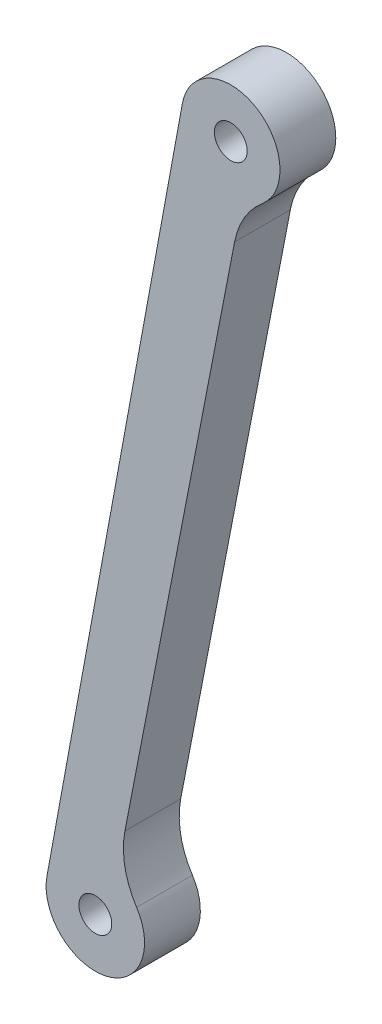
ISO-10303-21;
HEADER;
FILE_DESCRIPTION(('STEP AP214'),'2;1');
FILE_NAME('part.step','',(''),(''),'','','');
FILE_SCHEMA(('AUTOMOTIVE_DESIGN { 1 0 10303 214 1 1 1 1 }'));
ENDSEC;
DATA;
#1=APPLICATION_CONTEXT('core data for automotive mechanical design processes');
#2=APPLICATION_PROTOCOL_DEFINITION('international standard','automotive_design',2000,#1);
#3=PRODUCT_CONTEXT('',#1,'mechanical');
#4=PRODUCT('Part','Part','',(#3));
#5=PRODUCT_RELATED_PRODUCT_CATEGORY('part','',(#4));
#6=PRODUCT_DEFINITION_FORMATION('','',#4);
#7=PRODUCT_DEFINITION_CONTEXT('part definition',#1,'design');
#8=PRODUCT_DEFINITION('design','',#6,#7);
#9=PRODUCT_DEFINITION_SHAPE('','',#8);
#10=(LENGTH_UNIT() NAMED_UNIT(*) SI_UNIT(.MILLI.,.METRE.));
#11=(NAMED_UNIT(*) PLANE_ANGLE_UNIT() SI_UNIT($,.RADIAN.));
#12=(NAMED_UNIT(*) SI_UNIT($,.STERADIAN.) SOLID_ANGLE_UNIT());
#13=UNCERTAINTY_MEASURE_WITH_UNIT(LENGTH_MEASURE(1.E-05),#10,'distance_accuracy_value','');
#14=(GEOMETRIC_REPRESENTATION_CONTEXT(3) GLOBAL_UNCERTAINTY_ASSIGNED_CONTEXT((#13)) GLOBAL_UNIT_ASSIGNED_CONTEXT((#10,
#11,#12)) REPRESENTATION_CONTEXT('',''));
#15=CARTESIAN_POINT('',(0.,0.,0.));
#16=DIRECTION('',(0.,0.,1.));
#17=DIRECTION('',(1.,0.,0.));
#18=AXIS2_PLACEMENT_3D('',#15,#16,#17);
#19=CARTESIAN_POINT('',(31.2850615359514,81.9192149804247,3.4));
#20=DIRECTION('',(0.,0.,-1.));
#21=DIRECTION('',(-1.,0.,0.));
#22=AXIS2_PLACEMENT_3D('',#19,#20,#21);
#23=PLANE('',#22);
#24=CARTESIAN_POINT('',(31.2850615359514,81.9192149804247,3.4));
#25=DIRECTION('',(0.,0.,-1.));
#26=DIRECTION('',(-1.,0.,0.));
#27=AXIS2_PLACEMENT_3D('',#24,#25,#26);
#28=CIRCLE('',#27,5.);
#29=CARTESIAN_POINT('',(26.3766543349856,82.871863262587,3.4));
#30=VERTEX_POINT('',#29);
#31=CARTESIAN_POINT('',(28.0730585094993,85.75106003967,3.4));
#32=VERTEX_POINT('',#31);
#33=EDGE_CURVE('E128',#30,#32,#28,.T.);
#34=ORIENTED_EDGE('',*,*,#33,.T.);
#35=CARTESIAN_POINT('',(26.145856693628,88.0501670752172,3.4));
#36=DIRECTION('',(0.,0.,1.));
#37=DIRECTION('',(1.,0.,0.));
#38=AXIS2_PLACEMENT_3D('',#35,#36,#37);
#39=CIRCLE('',#38,3.);
#40=CARTESIAN_POINT('',(23.1952741449533,88.592442488136,3.4));
#41=VERTEX_POINT('',#40);
#42=EDGE_CURVE('E86',#32,#41,#39,.T.);
#43=ORIENTED_EDGE('',*,*,#42,.T.);
#44=DIRECTION('',(-0.180758470972937,-0.983527516224903,0.));
#45=VECTOR('',#44,1.);
#46=CARTESIAN_POINT('',(14.9394943531754,43.6718003218127,3.4));
#47=LINE('',#46,#45);
#48=CARTESIAN_POINT('',(14.9394943531754,43.6718003218127,3.4));
#49=VERTEX_POINT('',#48);
#50=EDGE_CURVE('E99',#41,#49,#47,.T.);
#51=ORIENTED_EDGE('',*,*,#50,.T.);
#52=CARTESIAN_POINT('',(17.8900769018501,43.1295249088939,3.4));
#53=DIRECTION('',(0.,0.,1.));
#54=DIRECTION('',(1.,0.,0.));
#55=AXIS2_PLACEMENT_3D('',#52,#53,#54);
#56=CIRCLE('',#55,3.);
#57=CARTESIAN_POINT('',(20.406889033319,44.7622088020254,3.4));
#58=VERTEX_POINT('',#57);
#59=EDGE_CURVE('E93',#49,#58,#56,.T.);
#60=ORIENTED_EDGE('',*,*,#59,.T.);
#61=CARTESIAN_POINT('',(24.6015759191005,47.4833486239112,3.4));
#62=DIRECTION('',(0.,0.,-1.));
#63=DIRECTION('',(1.,0.,0.));
#64=AXIS2_PLACEMENT_3D('',#61,#62,#63);
#65=CIRCLE('',#64,5.);
#66=CARTESIAN_POINT('',(19.6931687181346,48.4359969060735,3.4));
#67=VERTEX_POINT('',#66);
#68=EDGE_CURVE('E97',#58,#67,#65,.T.);
#69=ORIENTED_EDGE('',*,*,#68,.T.);
#70=DIRECTION('',(0.190529656432457,0.981681440193166,0.));
#71=VECTOR('',#70,1.);
#72=CARTESIAN_POINT('',(19.6931687181346,48.4359969060735,3.4));
#73=LINE('',#72,#71);
#74=EDGE_CURVE('E49',#67,#30,#73,.T.);
#75=ORIENTED_EDGE('',*,*,#74,.T.);
#76=EDGE_LOOP('',(#34,#43,#51,#60,#69,#75));
#77=FACE_BOUND('',#76,.T.);
#78=CARTESIAN_POINT('',(17.8900769018501,43.1295249088939,3.4));
#79=DIRECTION('',(0.,0.,1.));
#80=DIRECTION('',(1.,0.,0.));
#81=AXIS2_PLACEMENT_3D('',#78,#79,#80);
#82=CIRCLE('',#81,1.);
#83=CARTESIAN_POINT('',(18.8900769018501,43.1295249088939,3.4));
#84=VERTEX_POINT('',#83);
#85=EDGE_CURVE('E121',#84,#84,#82,.T.);
#86=ORIENTED_EDGE('',*,*,#85,.F.);
#87=EDGE_LOOP('',(#86));
#88=FACE_BOUND('',#87,.T.);
#89=CARTESIAN_POINT('',(26.145856693628,88.0501670752172,3.4));
#90=DIRECTION('',(0.,0.,1.));
#91=DIRECTION('',(1.,0.,0.));
#92=AXIS2_PLACEMENT_3D('',#89,#90,#91);
#93=CIRCLE('',#92,1.);
#94=CARTESIAN_POINT('',(27.145856693628,88.0501670752172,3.4));
#95=VERTEX_POINT('',#94);
#96=EDGE_CURVE('E169',#95,#95,#93,.T.);
#97=ORIENTED_EDGE('',*,*,#96,.F.);
#98=EDGE_LOOP('',(#97));
#99=FACE_BOUND('',#98,.T.);
#100=ADVANCED_FACE('F32',(#77,#88,#99),#23,.F.);
#101=CARTESIAN_POINT('',(31.2850615359514,81.9192149804247,0.));
#102=DIRECTION('',(0.,0.,-1.));
#103=DIRECTION('',(-1.,0.,0.));
#104=AXIS2_PLACEMENT_3D('',#101,#102,#103);
#105=PLANE('',#104);
#106=CARTESIAN_POINT('',(17.8900769018501,43.1295249088939,0.));
#107=DIRECTION('',(0.,0.,1.));
#108=DIRECTION('',(1.,0.,0.));
#109=AXIS2_PLACEMENT_3D('',#106,#107,#108);
#110=CIRCLE('',#109,1.);
#111=CARTESIAN_POINT('',(18.8900769018501,43.1295249088939,0.));
#112=VERTEX_POINT('',#111);
#113=EDGE_CURVE('E174',#112,#112,#110,.T.);
#114=ORIENTED_EDGE('',*,*,#113,.T.);
#115=EDGE_LOOP('',(#114));
#116=FACE_BOUND('',#115,.T.);
#117=CARTESIAN_POINT('',(31.2850615359514,81.9192149804247,0.));
#118=DIRECTION('',(0.,0.,-1.));
#119=DIRECTION('',(-1.,0.,0.));
#120=AXIS2_PLACEMENT_3D('',#117,#118,#119);
#121=CIRCLE('',#120,5.);
#122=CARTESIAN_POINT('',(26.3766543349856,82.871863262587,0.));
#123=VERTEX_POINT('',#122);
#124=CARTESIAN_POINT('',(28.0730585094993,85.75106003967,0.));
#125=VERTEX_POINT('',#124);
#126=EDGE_CURVE('E117',#123,#125,#121,.T.);
#127=ORIENTED_EDGE('',*,*,#126,.F.);
#128=DIRECTION('',(0.190529656432457,0.981681440193166,0.));
#129=VECTOR('',#128,1.);
#130=CARTESIAN_POINT('',(19.6931687181346,48.4359969060735,0.));
#131=LINE('',#130,#129);
#132=CARTESIAN_POINT('',(19.6931687181346,48.4359969060735,0.));
#133=VERTEX_POINT('',#132);
#134=EDGE_CURVE('E78',#133,#123,#131,.T.);
#135=ORIENTED_EDGE('',*,*,#134,.F.);
#136=CARTESIAN_POINT('',(24.6015759191005,47.4833486239112,0.));
#137=DIRECTION('',(0.,0.,-1.));
#138=DIRECTION('',(1.,0.,0.));
#139=AXIS2_PLACEMENT_3D('',#136,#137,#138);
#140=CIRCLE('',#139,5.);
#141=CARTESIAN_POINT('',(20.406889033319,44.7622088020254,0.));
#142=VERTEX_POINT('',#141);
#143=EDGE_CURVE('E72',#142,#133,#140,.T.);
#144=ORIENTED_EDGE('',*,*,#143,.F.);
#145=CARTESIAN_POINT('',(17.8900769018501,43.1295249088939,0.));
#146=DIRECTION('',(0.,0.,1.));
#147=DIRECTION('',(1.,0.,0.));
#148=AXIS2_PLACEMENT_3D('',#145,#146,#147);
#149=CIRCLE('',#148,3.);
#150=CARTESIAN_POINT('',(14.9394943531754,43.6718003218127,0.));
#151=VERTEX_POINT('',#150);
#152=EDGE_CURVE('E107',#151,#142,#149,.T.);
#153=ORIENTED_EDGE('',*,*,#152,.F.);
#154=DIRECTION('',(-0.180758470972937,-0.983527516224903,0.));
#155=VECTOR('',#154,1.);
#156=CARTESIAN_POINT('',(14.9394943531754,43.6718003218127,0.));
#157=LINE('',#156,#155);
#158=CARTESIAN_POINT('',(23.1952741449533,88.592442488136,0.));
#159=VERTEX_POINT('',#158);
#160=EDGE_CURVE('E123',#159,#151,#157,.T.);
#161=ORIENTED_EDGE('',*,*,#160,.F.);
#162=CARTESIAN_POINT('',(26.145856693628,88.0501670752172,0.));
#163=DIRECTION('',(0.,0.,1.));
#164=DIRECTION('',(1.,0.,0.));
#165=AXIS2_PLACEMENT_3D('',#162,#163,#164);
#166=CIRCLE('',#165,3.);
#167=EDGE_CURVE('E120',#125,#159,#166,.T.);
#168=ORIENTED_EDGE('',*,*,#167,.F.);
#169=EDGE_LOOP('',(#127,#135,#144,#153,#161,#168));
#170=FACE_BOUND('',#169,.T.);
#171=CARTESIAN_POINT('',(26.145856693628,88.0501670752172,0.));
#172=DIRECTION('',(0.,0.,1.));
#173=DIRECTION('',(1.,0.,0.));
#174=AXIS2_PLACEMENT_3D('',#171,#172,#173);
#175=CIRCLE('',#174,1.);
#176=CARTESIAN_POINT('',(27.145856693628,88.0501670752172,0.));
#177=VERTEX_POINT('',#176);
#178=EDGE_CURVE('E172',#177,#177,#175,.T.);
#179=ORIENTED_EDGE('',*,*,#178,.T.);
#180=EDGE_LOOP('',(#179));
#181=FACE_BOUND('',#180,.T.);
#182=ADVANCED_FACE('F137',(#116,#170,#181),#105,.T.);
#183=CARTESIAN_POINT('',(31.2850615359514,81.9192149804247,3.4));
#184=DIRECTION('',(0.,0.,-1.));
#185=DIRECTION('',(-1.,0.,0.));
#186=AXIS2_PLACEMENT_3D('',#183,#184,#185);
#187=CYLINDRICAL_SURFACE('',#186,5.);
#188=ORIENTED_EDGE('',*,*,#126,.T.);
#189=DIRECTION('',(0.,0.,-1.));
#190=VECTOR('',#189,1.);
#191=CARTESIAN_POINT('',(28.0730585094993,85.75106003967,3.4));
#192=LINE('',#191,#190);
#193=EDGE_CURVE('E11',#32,#125,#192,.T.);
#194=ORIENTED_EDGE('',*,*,#193,.F.);
#195=ORIENTED_EDGE('',*,*,#33,.F.);
#196=DIRECTION('',(0.,0.,-1.));
#197=VECTOR('',#196,1.);
#198=CARTESIAN_POINT('',(26.3766543349856,82.871863262587,3.4));
#199=LINE('',#198,#197);
#200=EDGE_CURVE('E113',#30,#123,#199,.T.);
#201=ORIENTED_EDGE('',*,*,#200,.T.);
#202=EDGE_LOOP('',(#188,#194,#195,#201));
#203=FACE_BOUND('',#202,.T.);
#204=ADVANCED_FACE('F34',(#203),#187,.F.);
#205=CARTESIAN_POINT('',(26.145856693628,88.0501670752172,3.4));
#206=DIRECTION('',(0.,0.,-1.));
#207=DIRECTION('',(-1.,0.,0.));
#208=AXIS2_PLACEMENT_3D('',#205,#206,#207);
#209=CYLINDRICAL_SURFACE('',#208,3.);
#210=ORIENTED_EDGE('',*,*,#167,.T.);
#211=DIRECTION('',(0.,0.,-1.));
#212=VECTOR('',#211,1.);
#213=CARTESIAN_POINT('',(23.1952741449533,88.592442488136,3.4));
#214=LINE('',#213,#212);
#215=EDGE_CURVE('E41',#41,#159,#214,.T.);
#216=ORIENTED_EDGE('',*,*,#215,.F.);
#217=ORIENTED_EDGE('',*,*,#42,.F.);
#218=ORIENTED_EDGE('',*,*,#193,.T.);
#219=EDGE_LOOP('',(#210,#216,#217,#218));
#220=FACE_BOUND('',#219,.T.);
#221=ADVANCED_FACE('F217',(#220),#209,.T.);
#222=CARTESIAN_POINT('',(14.9394943531754,43.6718003218127,3.4));
#223=DIRECTION('',(0.983527516224903,-0.180758470972937,0.));
#224=DIRECTION('',(0.180758470972937,0.983527516224903,0.));
#225=AXIS2_PLACEMENT_3D('',#222,#223,#224);
#226=PLANE('',#225);
#227=ORIENTED_EDGE('',*,*,#160,.T.);
#228=DIRECTION('',(0.,0.,-1.));
#229=VECTOR('',#228,1.);
#230=CARTESIAN_POINT('',(14.9394943531754,43.6718003218127,3.4));
#231=LINE('',#230,#229);
#232=EDGE_CURVE('E108',#49,#151,#231,.T.);
#233=ORIENTED_EDGE('',*,*,#232,.F.);
#234=ORIENTED_EDGE('',*,*,#50,.F.);
#235=ORIENTED_EDGE('',*,*,#215,.T.);
#236=EDGE_LOOP('',(#227,#233,#234,#235));
#237=FACE_BOUND('',#236,.T.);
#238=ADVANCED_FACE('F134',(#237),#226,.F.);
#239=CARTESIAN_POINT('',(17.8900769018501,43.1295249088939,3.4));
#240=DIRECTION('',(0.,0.,-1.));
#241=DIRECTION('',(-1.,0.,0.));
#242=AXIS2_PLACEMENT_3D('',#239,#240,#241);
#243=CYLINDRICAL_SURFACE('',#242,3.);
#244=ORIENTED_EDGE('',*,*,#152,.T.);
#245=DIRECTION('',(0.,0.,-1.));
#246=VECTOR('',#245,1.);
#247=CARTESIAN_POINT('',(20.406889033319,44.7622088020254,3.4));
#248=LINE('',#247,#246);
#249=EDGE_CURVE('E104',#58,#142,#248,.T.);
#250=ORIENTED_EDGE('',*,*,#249,.F.);
#251=ORIENTED_EDGE('',*,*,#59,.F.);
#252=ORIENTED_EDGE('',*,*,#232,.T.);
#253=EDGE_LOOP('',(#244,#250,#251,#252));
#254=FACE_BOUND('',#253,.T.);
#255=ADVANCED_FACE('F105',(#254),#243,.T.);
#256=CARTESIAN_POINT('',(24.6015759191005,47.4833486239112,3.4));
#257=DIRECTION('',(0.,0.,-1.));
#258=DIRECTION('',(-1.,0.,0.));
#259=AXIS2_PLACEMENT_3D('',#256,#257,#258);
#260=CYLINDRICAL_SURFACE('',#259,5.);
#261=ORIENTED_EDGE('',*,*,#143,.T.);
#262=DIRECTION('',(0.,0.,-1.));
#263=VECTOR('',#262,1.);
#264=CARTESIAN_POINT('',(19.6931687181346,48.4359969060735,3.4));
#265=LINE('',#264,#263);
#266=EDGE_CURVE('E109',#67,#133,#265,.T.);
#267=ORIENTED_EDGE('',*,*,#266,.F.);
#268=ORIENTED_EDGE('',*,*,#68,.F.);
#269=ORIENTED_EDGE('',*,*,#249,.T.);
#270=EDGE_LOOP('',(#261,#267,#268,#269));
#271=FACE_BOUND('',#270,.T.);
#272=ADVANCED_FACE('F111',(#271),#260,.F.);
#273=CARTESIAN_POINT('',(19.6931687181346,48.4359969060735,3.4));
#274=DIRECTION('',(-0.981681440193167,0.190529656432457,0.));
#275=DIRECTION('',(-0.190529656432457,-0.981681440193167,0.));
#276=AXIS2_PLACEMENT_3D('',#273,#274,#275);
#277=PLANE('',#276);
#278=ORIENTED_EDGE('',*,*,#134,.T.);
#279=ORIENTED_EDGE('',*,*,#200,.F.);
#280=ORIENTED_EDGE('',*,*,#74,.F.);
#281=ORIENTED_EDGE('',*,*,#266,.T.);
#282=EDGE_LOOP('',(#278,#279,#280,#281));
#283=FACE_BOUND('',#282,.T.);
#284=ADVANCED_FACE('F142',(#283),#277,.F.);
#285=CARTESIAN_POINT('',(17.8900769018501,43.1295249088939,3.4));
#286=DIRECTION('',(0.,0.,-1.));
#287=DIRECTION('',(-1.,0.,0.));
#288=AXIS2_PLACEMENT_3D('',#285,#286,#287);
#289=CYLINDRICAL_SURFACE('',#288,1.);
#290=ORIENTED_EDGE('',*,*,#85,.T.);
#291=EDGE_LOOP('',(#290));
#292=FACE_BOUND('',#291,.T.);
#293=ORIENTED_EDGE('',*,*,#113,.F.);
#294=EDGE_LOOP('',(#293));
#295=FACE_BOUND('',#294,.T.);
#296=ADVANCED_FACE('F144',(#292,#295),#289,.F.);
#297=CARTESIAN_POINT('',(26.145856693628,88.0501670752172,3.4));
#298=DIRECTION('',(0.,0.,-1.));
#299=DIRECTION('',(-1.,0.,0.));
#300=AXIS2_PLACEMENT_3D('',#297,#298,#299);
#301=CYLINDRICAL_SURFACE('',#300,1.);
#302=ORIENTED_EDGE('',*,*,#96,.T.);
#303=EDGE_LOOP('',(#302));
#304=FACE_BOUND('',#303,.T.);
#305=ORIENTED_EDGE('',*,*,#178,.F.);
#306=EDGE_LOOP('',(#305));
#307=FACE_BOUND('',#306,.T.);
#308=ADVANCED_FACE('F150',(#304,#307),#301,.F.);
#309=CLOSED_SHELL('',(#100,#182,#204,#221,#238,#255,#272,#284,#296,#308));
#310=MANIFOLD_SOLID_BREP('B2',#309);
#311=ADVANCED_BREP_SHAPE_REPRESENTATION('',(#18,#310),#14);
#312=SHAPE_DEFINITION_REPRESENTATION(#9,#311);
ENDSEC;
END-ISO-10303-21;
